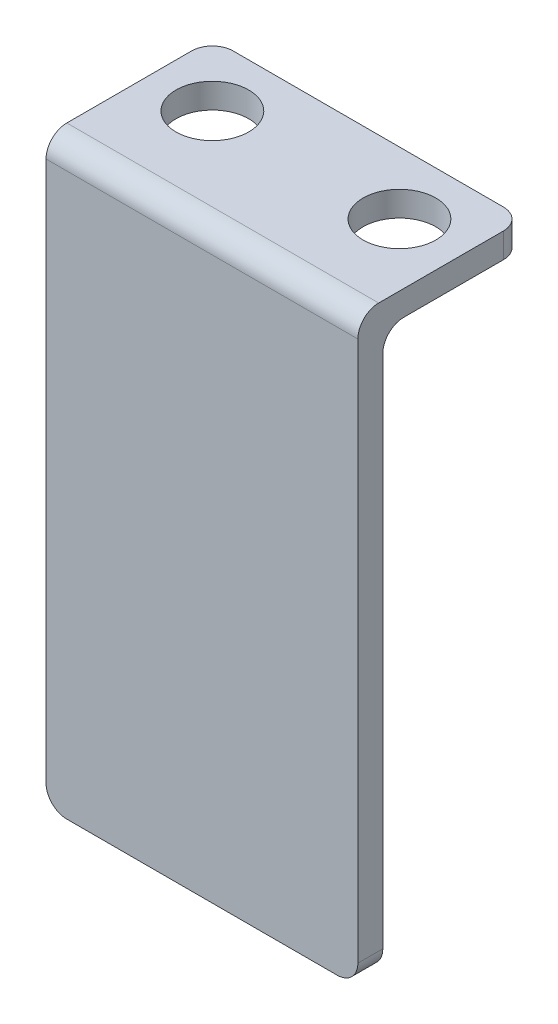
ISO-10303-21;
HEADER;
FILE_DESCRIPTION(('STEP AP214'),'2;1');
FILE_NAME('part.step','',(''),(''),'','','');
FILE_SCHEMA(('AUTOMOTIVE_DESIGN { 1 0 10303 214 1 1 1 1 }'));
ENDSEC;
DATA;
#1=APPLICATION_CONTEXT('core data for automotive mechanical design processes');
#2=APPLICATION_PROTOCOL_DEFINITION('international standard','automotive_design',2000,#1);
#3=PRODUCT_CONTEXT('',#1,'mechanical');
#4=PRODUCT('Part','Part','',(#3));
#5=PRODUCT_RELATED_PRODUCT_CATEGORY('part','',(#4));
#6=PRODUCT_DEFINITION_FORMATION('','',#4);
#7=PRODUCT_DEFINITION_CONTEXT('part definition',#1,'design');
#8=PRODUCT_DEFINITION('design','',#6,#7);
#9=PRODUCT_DEFINITION_SHAPE('','',#8);
#10=(LENGTH_UNIT() NAMED_UNIT(*) SI_UNIT(.MILLI.,.METRE.));
#11=(NAMED_UNIT(*) PLANE_ANGLE_UNIT() SI_UNIT($,.RADIAN.));
#12=(NAMED_UNIT(*) SI_UNIT($,.STERADIAN.) SOLID_ANGLE_UNIT());
#13=UNCERTAINTY_MEASURE_WITH_UNIT(LENGTH_MEASURE(1.E-05),#10,'distance_accuracy_value','');
#14=(GEOMETRIC_REPRESENTATION_CONTEXT(3) GLOBAL_UNCERTAINTY_ASSIGNED_CONTEXT((#13)) GLOBAL_UNIT_ASSIGNED_CONTEXT((#10,
#11,#12)) REPRESENTATION_CONTEXT('',''));
#15=CARTESIAN_POINT('',(0.,0.,0.));
#16=DIRECTION('',(0.,0.,1.));
#17=DIRECTION('',(1.,0.,0.));
#18=AXIS2_PLACEMENT_3D('',#15,#16,#17);
#19=CARTESIAN_POINT('',(15.,-1.2,0.));
#20=DIRECTION('',(0.,1.,0.));
#21=DIRECTION('',(0.,0.,1.));
#22=AXIS2_PLACEMENT_3D('',#19,#20,#21);
#23=PLANE('',#22);
#24=CARTESIAN_POINT('',(12.,-1.2,-5.));
#25=DIRECTION('',(0.,1.,0.));
#26=DIRECTION('',(0.,0.,1.));
#27=AXIS2_PLACEMENT_3D('',#24,#25,#26);
#28=CIRCLE('',#27,1.75);
#29=CARTESIAN_POINT('',(12.,-1.2,-3.25));
#30=VERTEX_POINT('',#29);
#31=EDGE_CURVE('E269',#30,#30,#28,.T.);
#32=ORIENTED_EDGE('',*,*,#31,.T.);
#33=EDGE_LOOP('',(#32));
#34=FACE_BOUND('',#33,.T.);
#35=CARTESIAN_POINT('',(3.,-1.2,-5.));
#36=DIRECTION('',(0.,1.,0.));
#37=DIRECTION('',(0.,0.,1.));
#38=AXIS2_PLACEMENT_3D('',#35,#36,#37);
#39=CIRCLE('',#38,1.75);
#40=CARTESIAN_POINT('',(3.,-1.2,-3.25));
#41=VERTEX_POINT('',#40);
#42=EDGE_CURVE('E133',#41,#41,#39,.T.);
#43=ORIENTED_EDGE('',*,*,#42,.T.);
#44=EDGE_LOOP('',(#43));
#45=FACE_BOUND('',#44,.T.);
#46=DIRECTION('',(0.,0.,-1.));
#47=VECTOR('',#46,1.);
#48=CARTESIAN_POINT('',(15.,-1.2,0.));
#49=LINE('',#48,#47);
#50=CARTESIAN_POINT('',(15.,-1.2,-2.2));
#51=VERTEX_POINT('',#50);
#52=CARTESIAN_POINT('',(15.,-1.2,-7.));
#53=VERTEX_POINT('',#52);
#54=EDGE_CURVE('E202',#51,#53,#49,.T.);
#55=ORIENTED_EDGE('',*,*,#54,.F.);
#56=DIRECTION('',(-1.,0.,0.));
#57=VECTOR('',#56,1.);
#58=CARTESIAN_POINT('',(0.,-1.2,-2.2));
#59=LINE('',#58,#57);
#60=CARTESIAN_POINT('',(0.,-1.2,-2.2));
#61=VERTEX_POINT('',#60);
#62=EDGE_CURVE('E129',#51,#61,#59,.T.);
#63=ORIENTED_EDGE('',*,*,#62,.T.);
#64=DIRECTION('',(0.,0.,-1.));
#65=VECTOR('',#64,1.);
#66=CARTESIAN_POINT('',(0.,-1.2,0.));
#67=LINE('',#66,#65);
#68=CARTESIAN_POINT('',(0.,-1.2,-7.));
#69=VERTEX_POINT('',#68);
#70=EDGE_CURVE('E123',#61,#69,#67,.T.);
#71=ORIENTED_EDGE('',*,*,#70,.T.);
#72=CARTESIAN_POINT('',(1.,-1.2,-7.));
#73=DIRECTION('',(0.,1.,0.));
#74=DIRECTION('',(0.,0.,1.));
#75=AXIS2_PLACEMENT_3D('',#72,#73,#74);
#76=CIRCLE('',#75,1.);
#77=CARTESIAN_POINT('',(1.,-1.2,-8.));
#78=VERTEX_POINT('',#77);
#79=EDGE_CURVE('E126',#69,#78,#76,.F.);
#80=ORIENTED_EDGE('',*,*,#79,.T.);
#81=DIRECTION('',(-1.,0.,0.));
#82=VECTOR('',#81,1.);
#83=CARTESIAN_POINT('',(15.,-1.2,-8.));
#84=LINE('',#83,#82);
#85=CARTESIAN_POINT('',(14.,-1.2,-8.));
#86=VERTEX_POINT('',#85);
#87=EDGE_CURVE('E150',#86,#78,#84,.T.);
#88=ORIENTED_EDGE('',*,*,#87,.F.);
#89=CARTESIAN_POINT('',(14.,-1.2,-7.));
#90=DIRECTION('',(0.,1.,0.));
#91=DIRECTION('',(0.,0.,1.));
#92=AXIS2_PLACEMENT_3D('',#89,#90,#91);
#93=CIRCLE('',#92,1.);
#94=EDGE_CURVE('E143',#86,#53,#93,.F.);
#95=ORIENTED_EDGE('',*,*,#94,.T.);
#96=EDGE_LOOP('',(#55,#63,#71,#80,#88,#95));
#97=FACE_BOUND('',#96,.T.);
#98=ADVANCED_FACE('F34',(#34,#45,#97),#23,.F.);
#99=CARTESIAN_POINT('',(15.,0.,-8.));
#100=DIRECTION('',(0.,0.,-1.));
#101=DIRECTION('',(-1.,0.,0.));
#102=AXIS2_PLACEMENT_3D('',#99,#100,#101);
#103=PLANE('',#102);
#104=ORIENTED_EDGE('',*,*,#87,.T.);
#105=DIRECTION('',(0.,-1.,0.));
#106=VECTOR('',#105,1.);
#107=CARTESIAN_POINT('',(1.,0.,-8.));
#108=LINE('',#107,#106);
#109=CARTESIAN_POINT('',(1.,0.,-8.));
#110=VERTEX_POINT('',#109);
#111=EDGE_CURVE('E141',#78,#110,#108,.F.);
#112=ORIENTED_EDGE('',*,*,#111,.T.);
#113=DIRECTION('',(-1.,0.,0.));
#114=VECTOR('',#113,1.);
#115=CARTESIAN_POINT('',(15.,0.,-8.));
#116=LINE('',#115,#114);
#117=CARTESIAN_POINT('',(14.,0.,-8.));
#118=VERTEX_POINT('',#117);
#119=EDGE_CURVE('E155',#118,#110,#116,.T.);
#120=ORIENTED_EDGE('',*,*,#119,.F.);
#121=DIRECTION('',(0.,-1.,0.));
#122=VECTOR('',#121,1.);
#123=CARTESIAN_POINT('',(14.,-1.2,-8.));
#124=LINE('',#123,#122);
#125=EDGE_CURVE('E142',#118,#86,#124,.T.);
#126=ORIENTED_EDGE('',*,*,#125,.T.);
#127=EDGE_LOOP('',(#104,#112,#120,#126));
#128=FACE_BOUND('',#127,.T.);
#129=ADVANCED_FACE('F213',(#128),#103,.T.);
#130=CARTESIAN_POINT('',(15.,0.,0.));
#131=DIRECTION('',(0.,1.,0.));
#132=DIRECTION('',(0.,0.,1.));
#133=AXIS2_PLACEMENT_3D('',#130,#131,#132);
#134=PLANE('',#133);
#135=CARTESIAN_POINT('',(12.,0.,-5.));
#136=DIRECTION('',(0.,1.,0.));
#137=DIRECTION('',(0.,0.,1.));
#138=AXIS2_PLACEMENT_3D('',#135,#136,#137);
#139=CIRCLE('',#138,1.75);
#140=CARTESIAN_POINT('',(12.,0.,-3.25));
#141=VERTEX_POINT('',#140);
#142=EDGE_CURVE('E271',#141,#141,#139,.T.);
#143=ORIENTED_EDGE('',*,*,#142,.F.);
#144=EDGE_LOOP('',(#143));
#145=FACE_BOUND('',#144,.T.);
#146=CARTESIAN_POINT('',(3.,0.,-5.));
#147=DIRECTION('',(0.,1.,0.));
#148=DIRECTION('',(0.,0.,1.));
#149=AXIS2_PLACEMENT_3D('',#146,#147,#148);
#150=CIRCLE('',#149,1.75);
#151=CARTESIAN_POINT('',(3.,0.,-3.25));
#152=VERTEX_POINT('',#151);
#153=EDGE_CURVE('E266',#152,#152,#150,.T.);
#154=ORIENTED_EDGE('',*,*,#153,.F.);
#155=EDGE_LOOP('',(#154));
#156=FACE_BOUND('',#155,.T.);
#157=DIRECTION('',(0.,0.,-1.));
#158=VECTOR('',#157,1.);
#159=CARTESIAN_POINT('',(0.,0.,0.));
#160=LINE('',#159,#158);
#161=CARTESIAN_POINT('',(0.,0.,-1.));
#162=VERTEX_POINT('',#161);
#163=CARTESIAN_POINT('',(0.,0.,-7.));
#164=VERTEX_POINT('',#163);
#165=EDGE_CURVE('E132',#162,#164,#160,.T.);
#166=ORIENTED_EDGE('',*,*,#165,.F.);
#167=DIRECTION('',(-1.,0.,0.));
#168=VECTOR('',#167,1.);
#169=CARTESIAN_POINT('',(15.,0.,-1.));
#170=LINE('',#169,#168);
#171=CARTESIAN_POINT('',(15.,0.,-1.));
#172=VERTEX_POINT('',#171);
#173=EDGE_CURVE('E190',#162,#172,#170,.F.);
#174=ORIENTED_EDGE('',*,*,#173,.T.);
#175=DIRECTION('',(0.,0.,-1.));
#176=VECTOR('',#175,1.);
#177=CARTESIAN_POINT('',(15.,0.,0.));
#178=LINE('',#177,#176);
#179=CARTESIAN_POINT('',(15.,0.,-7.));
#180=VERTEX_POINT('',#179);
#181=EDGE_CURVE('E248',#172,#180,#178,.T.);
#182=ORIENTED_EDGE('',*,*,#181,.T.);
#183=CARTESIAN_POINT('',(14.,0.,-7.));
#184=DIRECTION('',(0.,1.,0.));
#185=DIRECTION('',(0.,0.,1.));
#186=AXIS2_PLACEMENT_3D('',#183,#184,#185);
#187=CIRCLE('',#186,1.);
#188=EDGE_CURVE('E181',#180,#118,#187,.T.);
#189=ORIENTED_EDGE('',*,*,#188,.T.);
#190=ORIENTED_EDGE('',*,*,#119,.T.);
#191=CARTESIAN_POINT('',(1.,0.,-7.));
#192=DIRECTION('',(0.,1.,0.));
#193=DIRECTION('',(0.,0.,1.));
#194=AXIS2_PLACEMENT_3D('',#191,#192,#193);
#195=CIRCLE('',#194,1.);
#196=EDGE_CURVE('E183',#110,#164,#195,.T.);
#197=ORIENTED_EDGE('',*,*,#196,.T.);
#198=EDGE_LOOP('',(#166,#174,#182,#189,#190,#197));
#199=FACE_BOUND('',#198,.T.);
#200=ADVANCED_FACE('F219',(#145,#156,#199),#134,.T.);
#201=CARTESIAN_POINT('',(15.,-28.,0.));
#202=DIRECTION('',(0.,0.,1.));
#203=DIRECTION('',(1.,0.,0.));
#204=AXIS2_PLACEMENT_3D('',#201,#202,#203);
#205=PLANE('',#204);
#206=DIRECTION('',(0.,1.,0.));
#207=VECTOR('',#206,1.);
#208=CARTESIAN_POINT('',(15.,-28.,0.));
#209=LINE('',#208,#207);
#210=CARTESIAN_POINT('',(15.,-27.,0.));
#211=VERTEX_POINT('',#210);
#212=CARTESIAN_POINT('',(15.,-1.,0.));
#213=VERTEX_POINT('',#212);
#214=EDGE_CURVE('E259',#211,#213,#209,.T.);
#215=ORIENTED_EDGE('',*,*,#214,.T.);
#216=DIRECTION('',(-1.,0.,0.));
#217=VECTOR('',#216,1.);
#218=CARTESIAN_POINT('',(15.,-1.,0.));
#219=LINE('',#218,#217);
#220=CARTESIAN_POINT('',(0.,-1.,0.));
#221=VERTEX_POINT('',#220);
#222=EDGE_CURVE('E185',#213,#221,#219,.T.);
#223=ORIENTED_EDGE('',*,*,#222,.T.);
#224=DIRECTION('',(0.,1.,0.));
#225=VECTOR('',#224,1.);
#226=CARTESIAN_POINT('',(0.,-28.,0.));
#227=LINE('',#226,#225);
#228=CARTESIAN_POINT('',(0.,-27.,0.));
#229=VERTEX_POINT('',#228);
#230=EDGE_CURVE('E203',#229,#221,#227,.T.);
#231=ORIENTED_EDGE('',*,*,#230,.F.);
#232=CARTESIAN_POINT('',(1.,-27.,0.));
#233=DIRECTION('',(0.,0.,1.));
#234=DIRECTION('',(1.,0.,0.));
#235=AXIS2_PLACEMENT_3D('',#232,#233,#234);
#236=CIRCLE('',#235,1.);
#237=CARTESIAN_POINT('',(1.,-28.,0.));
#238=VERTEX_POINT('',#237);
#239=EDGE_CURVE('E160',#229,#238,#236,.T.);
#240=ORIENTED_EDGE('',*,*,#239,.T.);
#241=DIRECTION('',(-1.,0.,0.));
#242=VECTOR('',#241,1.);
#243=CARTESIAN_POINT('',(15.,-28.,0.));
#244=LINE('',#243,#242);
#245=CARTESIAN_POINT('',(14.,-28.,0.));
#246=VERTEX_POINT('',#245);
#247=EDGE_CURVE('E249',#246,#238,#244,.T.);
#248=ORIENTED_EDGE('',*,*,#247,.F.);
#249=CARTESIAN_POINT('',(14.,-27.,0.));
#250=DIRECTION('',(0.,0.,1.));
#251=DIRECTION('',(1.,0.,0.));
#252=AXIS2_PLACEMENT_3D('',#249,#250,#251);
#253=CIRCLE('',#252,1.);
#254=EDGE_CURVE('E153',#246,#211,#253,.T.);
#255=ORIENTED_EDGE('',*,*,#254,.T.);
#256=EDGE_LOOP('',(#215,#223,#231,#240,#248,#255));
#257=FACE_BOUND('',#256,.T.);
#258=ADVANCED_FACE('F279',(#257),#205,.T.);
#259=CARTESIAN_POINT('',(15.,-28.,-1.2));
#260=DIRECTION('',(0.,-1.,0.));
#261=DIRECTION('',(0.,0.,-1.));
#262=AXIS2_PLACEMENT_3D('',#259,#260,#261);
#263=PLANE('',#262);
#264=ORIENTED_EDGE('',*,*,#247,.T.);
#265=DIRECTION('',(0.,0.,1.));
#266=VECTOR('',#265,1.);
#267=CARTESIAN_POINT('',(1.,-28.,-1.2));
#268=LINE('',#267,#266);
#269=CARTESIAN_POINT('',(1.,-28.,-1.2));
#270=VERTEX_POINT('',#269);
#271=EDGE_CURVE('E165',#238,#270,#268,.F.);
#272=ORIENTED_EDGE('',*,*,#271,.T.);
#273=DIRECTION('',(-1.,0.,0.));
#274=VECTOR('',#273,1.);
#275=CARTESIAN_POINT('',(15.,-28.,-1.2));
#276=LINE('',#275,#274);
#277=CARTESIAN_POINT('',(14.,-28.,-1.2));
#278=VERTEX_POINT('',#277);
#279=EDGE_CURVE('E251',#278,#270,#276,.T.);
#280=ORIENTED_EDGE('',*,*,#279,.F.);
#281=DIRECTION('',(0.,0.,1.));
#282=VECTOR('',#281,1.);
#283=CARTESIAN_POINT('',(14.,-28.,0.));
#284=LINE('',#283,#282);
#285=EDGE_CURVE('E162',#278,#246,#284,.T.);
#286=ORIENTED_EDGE('',*,*,#285,.T.);
#287=EDGE_LOOP('',(#264,#272,#280,#286));
#288=FACE_BOUND('',#287,.T.);
#289=ADVANCED_FACE('F299',(#288),#263,.T.);
#290=CARTESIAN_POINT('',(15.,-28.,-1.2));
#291=DIRECTION('',(0.,0.,1.));
#292=DIRECTION('',(1.,0.,0.));
#293=AXIS2_PLACEMENT_3D('',#290,#291,#292);
#294=PLANE('',#293);
#295=DIRECTION('',(0.,1.,0.));
#296=VECTOR('',#295,1.);
#297=CARTESIAN_POINT('',(0.,-28.,-1.2));
#298=LINE('',#297,#296);
#299=CARTESIAN_POINT('',(0.,-27.,-1.2));
#300=VERTEX_POINT('',#299);
#301=CARTESIAN_POINT('',(0.,-2.2,-1.2));
#302=VERTEX_POINT('',#301);
#303=EDGE_CURVE('E196',#300,#302,#298,.T.);
#304=ORIENTED_EDGE('',*,*,#303,.T.);
#305=DIRECTION('',(-1.,0.,0.));
#306=VECTOR('',#305,1.);
#307=CARTESIAN_POINT('',(15.,-2.2,-1.2));
#308=LINE('',#307,#306);
#309=CARTESIAN_POINT('',(15.,-2.2,-1.2));
#310=VERTEX_POINT('',#309);
#311=EDGE_CURVE('E55',#302,#310,#308,.F.);
#312=ORIENTED_EDGE('',*,*,#311,.T.);
#313=DIRECTION('',(0.,1.,0.));
#314=VECTOR('',#313,1.);
#315=CARTESIAN_POINT('',(15.,-28.,-1.2));
#316=LINE('',#315,#314);
#317=CARTESIAN_POINT('',(15.,-27.,-1.2));
#318=VERTEX_POINT('',#317);
#319=EDGE_CURVE('E254',#318,#310,#316,.T.);
#320=ORIENTED_EDGE('',*,*,#319,.F.);
#321=CARTESIAN_POINT('',(14.,-27.,-1.2));
#322=DIRECTION('',(0.,0.,1.));
#323=DIRECTION('',(1.,0.,0.));
#324=AXIS2_PLACEMENT_3D('',#321,#322,#323);
#325=CIRCLE('',#324,1.);
#326=EDGE_CURVE('E167',#318,#278,#325,.F.);
#327=ORIENTED_EDGE('',*,*,#326,.T.);
#328=ORIENTED_EDGE('',*,*,#279,.T.);
#329=CARTESIAN_POINT('',(1.,-27.,-1.2));
#330=DIRECTION('',(0.,0.,1.));
#331=DIRECTION('',(1.,0.,0.));
#332=AXIS2_PLACEMENT_3D('',#329,#330,#331);
#333=CIRCLE('',#332,1.);
#334=EDGE_CURVE('E169',#270,#300,#333,.F.);
#335=ORIENTED_EDGE('',*,*,#334,.T.);
#336=EDGE_LOOP('',(#304,#312,#320,#327,#328,#335));
#337=FACE_BOUND('',#336,.T.);
#338=ADVANCED_FACE('F199',(#337),#294,.F.);
#339=CARTESIAN_POINT('',(15.,0.,0.));
#340=DIRECTION('',(-1.,0.,0.));
#341=DIRECTION('',(0.,0.,1.));
#342=AXIS2_PLACEMENT_3D('',#339,#340,#341);
#343=PLANE('',#342);
#344=ORIENTED_EDGE('',*,*,#181,.F.);
#345=CARTESIAN_POINT('',(15.,-1.,-1.));
#346=DIRECTION('',(-1.,0.,0.));
#347=DIRECTION('',(0.,0.,1.));
#348=AXIS2_PLACEMENT_3D('',#345,#346,#347);
#349=CIRCLE('',#348,1.);
#350=EDGE_CURVE('E192',#172,#213,#349,.F.);
#351=ORIENTED_EDGE('',*,*,#350,.T.);
#352=ORIENTED_EDGE('',*,*,#214,.F.);
#353=DIRECTION('',(0.,0.,1.));
#354=VECTOR('',#353,1.);
#355=CARTESIAN_POINT('',(15.,-27.,-1.2));
#356=LINE('',#355,#354);
#357=EDGE_CURVE('E174',#211,#318,#356,.F.);
#358=ORIENTED_EDGE('',*,*,#357,.T.);
#359=ORIENTED_EDGE('',*,*,#319,.T.);
#360=CARTESIAN_POINT('',(15.,-2.2,-2.2));
#361=DIRECTION('',(-1.,0.,0.));
#362=DIRECTION('',(0.,0.,1.));
#363=AXIS2_PLACEMENT_3D('',#360,#361,#362);
#364=CIRCLE('',#363,1.);
#365=EDGE_CURVE('E11',#310,#51,#364,.T.);
#366=ORIENTED_EDGE('',*,*,#365,.T.);
#367=ORIENTED_EDGE('',*,*,#54,.T.);
#368=DIRECTION('',(0.,-1.,0.));
#369=VECTOR('',#368,1.);
#370=CARTESIAN_POINT('',(15.,0.,-7.));
#371=LINE('',#370,#369);
#372=EDGE_CURVE('E171',#53,#180,#371,.F.);
#373=ORIENTED_EDGE('',*,*,#372,.T.);
#374=EDGE_LOOP('',(#344,#351,#352,#358,#359,#366,#367,#373));
#375=FACE_BOUND('',#374,.T.);
#376=ADVANCED_FACE('F292',(#375),#343,.F.);
#377=CARTESIAN_POINT('',(0.,0.,0.));
#378=DIRECTION('',(-1.,0.,0.));
#379=DIRECTION('',(0.,0.,1.));
#380=AXIS2_PLACEMENT_3D('',#377,#378,#379);
#381=PLANE('',#380);
#382=ORIENTED_EDGE('',*,*,#230,.T.);
#383=CARTESIAN_POINT('',(0.,-1.,-1.));
#384=DIRECTION('',(-1.,0.,0.));
#385=DIRECTION('',(0.,0.,1.));
#386=AXIS2_PLACEMENT_3D('',#383,#384,#385);
#387=CIRCLE('',#386,1.);
#388=EDGE_CURVE('E188',#221,#162,#387,.T.);
#389=ORIENTED_EDGE('',*,*,#388,.T.);
#390=ORIENTED_EDGE('',*,*,#165,.T.);
#391=DIRECTION('',(0.,-1.,0.));
#392=VECTOR('',#391,1.);
#393=CARTESIAN_POINT('',(0.,0.,-7.));
#394=LINE('',#393,#392);
#395=EDGE_CURVE('E140',#164,#69,#394,.T.);
#396=ORIENTED_EDGE('',*,*,#395,.T.);
#397=ORIENTED_EDGE('',*,*,#70,.F.);
#398=CARTESIAN_POINT('',(0.,-2.2,-2.2));
#399=DIRECTION('',(-1.,0.,0.));
#400=DIRECTION('',(0.,0.,1.));
#401=AXIS2_PLACEMENT_3D('',#398,#399,#400);
#402=CIRCLE('',#401,1.);
#403=EDGE_CURVE('E42',#61,#302,#402,.F.);
#404=ORIENTED_EDGE('',*,*,#403,.T.);
#405=ORIENTED_EDGE('',*,*,#303,.F.);
#406=DIRECTION('',(0.,0.,1.));
#407=VECTOR('',#406,1.);
#408=CARTESIAN_POINT('',(0.,-27.,0.));
#409=LINE('',#408,#407);
#410=EDGE_CURVE('E149',#300,#229,#409,.T.);
#411=ORIENTED_EDGE('',*,*,#410,.T.);
#412=EDGE_LOOP('',(#382,#389,#390,#396,#397,#404,#405,#411));
#413=FACE_BOUND('',#412,.T.);
#414=ADVANCED_FACE('F146',(#413),#381,.T.);
#415=CARTESIAN_POINT('',(3.,0.,-5.));
#416=DIRECTION('',(0.,1.,0.));
#417=DIRECTION('',(0.,0.,1.));
#418=AXIS2_PLACEMENT_3D('',#415,#416,#417);
#419=CYLINDRICAL_SURFACE('',#418,1.75);
#420=ORIENTED_EDGE('',*,*,#153,.T.);
#421=EDGE_LOOP('',(#420));
#422=FACE_BOUND('',#421,.T.);
#423=ORIENTED_EDGE('',*,*,#42,.F.);
#424=EDGE_LOOP('',(#423));
#425=FACE_BOUND('',#424,.T.);
#426=ADVANCED_FACE('F282',(#422,#425),#419,.F.);
#427=CARTESIAN_POINT('',(12.,0.,-5.));
#428=DIRECTION('',(0.,1.,0.));
#429=DIRECTION('',(0.,0.,1.));
#430=AXIS2_PLACEMENT_3D('',#427,#428,#429);
#431=CYLINDRICAL_SURFACE('',#430,1.75);
#432=ORIENTED_EDGE('',*,*,#142,.T.);
#433=EDGE_LOOP('',(#432));
#434=FACE_BOUND('',#433,.T.);
#435=ORIENTED_EDGE('',*,*,#31,.F.);
#436=EDGE_LOOP('',(#435));
#437=FACE_BOUND('',#436,.T.);
#438=ADVANCED_FACE('F230',(#434,#437),#431,.F.);
#439=CARTESIAN_POINT('',(1.,-27.,0.));
#440=DIRECTION('',(0.,0.,1.));
#441=DIRECTION('',(1.,0.,0.));
#442=AXIS2_PLACEMENT_3D('',#439,#440,#441);
#443=CYLINDRICAL_SURFACE('',#442,1.);
#444=ORIENTED_EDGE('',*,*,#334,.F.);
#445=ORIENTED_EDGE('',*,*,#271,.F.);
#446=ORIENTED_EDGE('',*,*,#239,.F.);
#447=ORIENTED_EDGE('',*,*,#410,.F.);
#448=EDGE_LOOP('',(#444,#445,#446,#447));
#449=FACE_BOUND('',#448,.T.);
#450=ADVANCED_FACE('F226',(#449),#443,.T.);
#451=CARTESIAN_POINT('',(14.,-27.,-1.2));
#452=DIRECTION('',(0.,0.,-1.));
#453=DIRECTION('',(-1.,0.,0.));
#454=AXIS2_PLACEMENT_3D('',#451,#452,#453);
#455=CYLINDRICAL_SURFACE('',#454,1.);
#456=ORIENTED_EDGE('',*,*,#326,.F.);
#457=ORIENTED_EDGE('',*,*,#357,.F.);
#458=ORIENTED_EDGE('',*,*,#254,.F.);
#459=ORIENTED_EDGE('',*,*,#285,.F.);
#460=EDGE_LOOP('',(#456,#457,#458,#459));
#461=FACE_BOUND('',#460,.T.);
#462=ADVANCED_FACE('F229',(#461),#455,.T.);
#463=CARTESIAN_POINT('',(1.,0.,-7.));
#464=DIRECTION('',(0.,-1.,0.));
#465=DIRECTION('',(0.,0.,-1.));
#466=AXIS2_PLACEMENT_3D('',#463,#464,#465);
#467=CYLINDRICAL_SURFACE('',#466,1.);
#468=ORIENTED_EDGE('',*,*,#196,.F.);
#469=ORIENTED_EDGE('',*,*,#111,.F.);
#470=ORIENTED_EDGE('',*,*,#79,.F.);
#471=ORIENTED_EDGE('',*,*,#395,.F.);
#472=EDGE_LOOP('',(#468,#469,#470,#471));
#473=FACE_BOUND('',#472,.T.);
#474=ADVANCED_FACE('F139',(#473),#467,.T.);
#475=CARTESIAN_POINT('',(14.,0.,-7.));
#476=DIRECTION('',(0.,1.,0.));
#477=DIRECTION('',(0.,0.,1.));
#478=AXIS2_PLACEMENT_3D('',#475,#476,#477);
#479=CYLINDRICAL_SURFACE('',#478,1.);
#480=ORIENTED_EDGE('',*,*,#188,.F.);
#481=ORIENTED_EDGE('',*,*,#372,.F.);
#482=ORIENTED_EDGE('',*,*,#94,.F.);
#483=ORIENTED_EDGE('',*,*,#125,.F.);
#484=EDGE_LOOP('',(#480,#481,#482,#483));
#485=FACE_BOUND('',#484,.T.);
#486=ADVANCED_FACE('F210',(#485),#479,.T.);
#487=CARTESIAN_POINT('',(15.,-1.,-1.));
#488=DIRECTION('',(-1.,0.,0.));
#489=DIRECTION('',(0.,0.,1.));
#490=AXIS2_PLACEMENT_3D('',#487,#488,#489);
#491=CYLINDRICAL_SURFACE('',#490,1.);
#492=ORIENTED_EDGE('',*,*,#350,.F.);
#493=ORIENTED_EDGE('',*,*,#173,.F.);
#494=ORIENTED_EDGE('',*,*,#388,.F.);
#495=ORIENTED_EDGE('',*,*,#222,.F.);
#496=EDGE_LOOP('',(#492,#493,#494,#495));
#497=FACE_BOUND('',#496,.T.);
#498=ADVANCED_FACE('F206',(#497),#491,.T.);
#499=CARTESIAN_POINT('',(15.,-2.2,-2.2));
#500=DIRECTION('',(1.,0.,0.));
#501=DIRECTION('',(0.,0.,-1.));
#502=AXIS2_PLACEMENT_3D('',#499,#500,#501);
#503=CYLINDRICAL_SURFACE('',#502,1.);
#504=ORIENTED_EDGE('',*,*,#365,.F.);
#505=ORIENTED_EDGE('',*,*,#311,.F.);
#506=ORIENTED_EDGE('',*,*,#403,.F.);
#507=ORIENTED_EDGE('',*,*,#62,.F.);
#508=EDGE_LOOP('',(#504,#505,#506,#507));
#509=FACE_BOUND('',#508,.T.);
#510=ADVANCED_FACE('F36',(#509),#503,.F.);
#511=CLOSED_SHELL('',(#98,#129,#200,#258,#289,#338,#376,#414,#426,#438,#450,#462,#474,#486,#498,#510));
#512=MANIFOLD_SOLID_BREP('B2',#511);
#513=ADVANCED_BREP_SHAPE_REPRESENTATION('',(#18,#512),#14);
#514=SHAPE_DEFINITION_REPRESENTATION(#9,#513);
ENDSEC;
END-ISO-10303-21;
